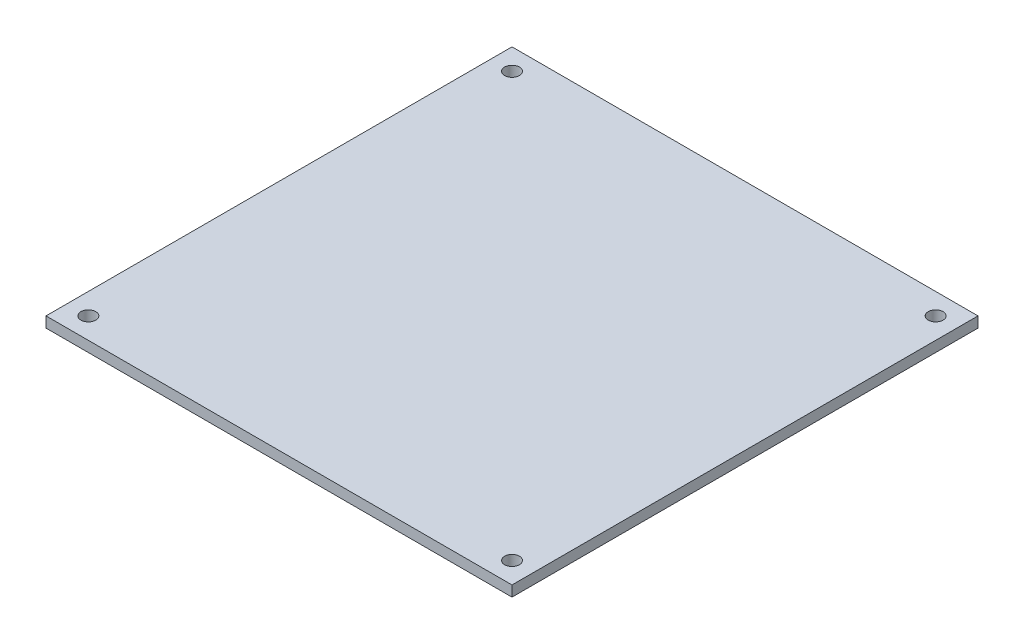
ISO-10303-21;
HEADER;
FILE_DESCRIPTION(('STEP AP214'),'2;1');
FILE_NAME('part.step','',(''),(''),'','','');
FILE_SCHEMA(('AUTOMOTIVE_DESIGN { 1 0 10303 214 1 1 1 1 }'));
ENDSEC;
DATA;
#1=APPLICATION_CONTEXT('core data for automotive mechanical design processes');
#2=APPLICATION_PROTOCOL_DEFINITION('international standard','automotive_design',2000,#1);
#3=PRODUCT_CONTEXT('',#1,'mechanical');
#4=PRODUCT('Part','Part','',(#3));
#5=PRODUCT_RELATED_PRODUCT_CATEGORY('part','',(#4));
#6=PRODUCT_DEFINITION_FORMATION('','',#4);
#7=PRODUCT_DEFINITION_CONTEXT('part definition',#1,'design');
#8=PRODUCT_DEFINITION('design','',#6,#7);
#9=PRODUCT_DEFINITION_SHAPE('','',#8);
#10=(LENGTH_UNIT() NAMED_UNIT(*) SI_UNIT(.MILLI.,.METRE.));
#11=(NAMED_UNIT(*) PLANE_ANGLE_UNIT() SI_UNIT($,.RADIAN.));
#12=(NAMED_UNIT(*) SI_UNIT($,.STERADIAN.) SOLID_ANGLE_UNIT());
#13=UNCERTAINTY_MEASURE_WITH_UNIT(LENGTH_MEASURE(1.E-05),#10,'distance_accuracy_value','');
#14=(GEOMETRIC_REPRESENTATION_CONTEXT(3) GLOBAL_UNCERTAINTY_ASSIGNED_CONTEXT((#13)) GLOBAL_UNIT_ASSIGNED_CONTEXT((#10,
#11,#12)) REPRESENTATION_CONTEXT('',''));
#15=CARTESIAN_POINT('',(0.,0.,0.));
#16=DIRECTION('',(0.,0.,1.));
#17=DIRECTION('',(1.,0.,0.));
#18=AXIS2_PLACEMENT_3D('',#15,#16,#17);
#19=CARTESIAN_POINT('',(110.,2.5,110.));
#20=DIRECTION('',(-1.,0.,0.));
#21=DIRECTION('',(0.,0.,1.));
#22=AXIS2_PLACEMENT_3D('',#19,#20,#21);
#23=PLANE('',#22);
#24=DIRECTION('',(0.,0.,-1.));
#25=VECTOR('',#24,1.);
#26=CARTESIAN_POINT('',(110.,-2.5,110.));
#27=LINE('',#26,#25);
#28=CARTESIAN_POINT('',(110.,-2.5,110.));
#29=VERTEX_POINT('',#28);
#30=CARTESIAN_POINT('',(110.,-2.5,-110.));
#31=VERTEX_POINT('',#30);
#32=EDGE_CURVE('E97',#29,#31,#27,.T.);
#33=ORIENTED_EDGE('',*,*,#32,.T.);
#34=DIRECTION('',(0.,-1.,0.));
#35=VECTOR('',#34,1.);
#36=CARTESIAN_POINT('',(110.,2.5,-110.));
#37=LINE('',#36,#35);
#38=CARTESIAN_POINT('',(110.,2.5,-110.));
#39=VERTEX_POINT('',#38);
#40=EDGE_CURVE('E11',#39,#31,#37,.T.);
#41=ORIENTED_EDGE('',*,*,#40,.F.);
#42=DIRECTION('',(0.,0.,-1.));
#43=VECTOR('',#42,1.);
#44=CARTESIAN_POINT('',(110.,2.5,110.));
#45=LINE('',#44,#43);
#46=CARTESIAN_POINT('',(110.,2.5,110.));
#47=VERTEX_POINT('',#46);
#48=EDGE_CURVE('E85',#47,#39,#45,.T.);
#49=ORIENTED_EDGE('',*,*,#48,.F.);
#50=DIRECTION('',(0.,-1.,0.));
#51=VECTOR('',#50,1.);
#52=CARTESIAN_POINT('',(110.,2.5,110.));
#53=LINE('',#52,#51);
#54=EDGE_CURVE('E93',#47,#29,#53,.T.);
#55=ORIENTED_EDGE('',*,*,#54,.T.);
#56=EDGE_LOOP('',(#33,#41,#49,#55));
#57=FACE_BOUND('',#56,.T.);
#58=ADVANCED_FACE('F34',(#57),#23,.F.);
#59=CARTESIAN_POINT('',(-110.,2.5,-110.));
#60=DIRECTION('',(0.,0.,1.));
#61=DIRECTION('',(1.,0.,0.));
#62=AXIS2_PLACEMENT_3D('',#59,#60,#61);
#63=PLANE('',#62);
#64=DIRECTION('',(-1.,0.,0.));
#65=VECTOR('',#64,1.);
#66=CARTESIAN_POINT('',(-110.,-2.5,-110.));
#67=LINE('',#66,#65);
#68=CARTESIAN_POINT('',(-110.,-2.5,-110.));
#69=VERTEX_POINT('',#68);
#70=EDGE_CURVE('E89',#31,#69,#67,.T.);
#71=ORIENTED_EDGE('',*,*,#70,.T.);
#72=DIRECTION('',(0.,-1.,0.));
#73=VECTOR('',#72,1.);
#74=CARTESIAN_POINT('',(-110.,2.5,-110.));
#75=LINE('',#74,#73);
#76=CARTESIAN_POINT('',(-110.,2.5,-110.));
#77=VERTEX_POINT('',#76);
#78=EDGE_CURVE('E42',#77,#69,#75,.T.);
#79=ORIENTED_EDGE('',*,*,#78,.F.);
#80=DIRECTION('',(-1.,0.,0.));
#81=VECTOR('',#80,1.);
#82=CARTESIAN_POINT('',(-110.,2.5,-110.));
#83=LINE('',#82,#81);
#84=EDGE_CURVE('E80',#39,#77,#83,.T.);
#85=ORIENTED_EDGE('',*,*,#84,.F.);
#86=ORIENTED_EDGE('',*,*,#40,.T.);
#87=EDGE_LOOP('',(#71,#79,#85,#86));
#88=FACE_BOUND('',#87,.T.);
#89=ADVANCED_FACE('F88',(#88),#63,.F.);
#90=CARTESIAN_POINT('',(-110.,2.5,110.));
#91=DIRECTION('',(1.,0.,0.));
#92=DIRECTION('',(0.,0.,-1.));
#93=AXIS2_PLACEMENT_3D('',#90,#91,#92);
#94=PLANE('',#93);
#95=DIRECTION('',(0.,0.,1.));
#96=VECTOR('',#95,1.);
#97=CARTESIAN_POINT('',(-110.,-2.5,110.));
#98=LINE('',#97,#96);
#99=CARTESIAN_POINT('',(-110.,-2.5,110.));
#100=VERTEX_POINT('',#99);
#101=EDGE_CURVE('E67',#69,#100,#98,.T.);
#102=ORIENTED_EDGE('',*,*,#101,.T.);
#103=DIRECTION('',(0.,-1.,0.));
#104=VECTOR('',#103,1.);
#105=CARTESIAN_POINT('',(-110.,2.5,110.));
#106=LINE('',#105,#104);
#107=CARTESIAN_POINT('',(-110.,2.5,110.));
#108=VERTEX_POINT('',#107);
#109=EDGE_CURVE('E90',#108,#100,#106,.T.);
#110=ORIENTED_EDGE('',*,*,#109,.F.);
#111=DIRECTION('',(0.,0.,1.));
#112=VECTOR('',#111,1.);
#113=CARTESIAN_POINT('',(-110.,2.5,110.));
#114=LINE('',#113,#112);
#115=EDGE_CURVE('E83',#77,#108,#114,.T.);
#116=ORIENTED_EDGE('',*,*,#115,.F.);
#117=ORIENTED_EDGE('',*,*,#78,.T.);
#118=EDGE_LOOP('',(#102,#110,#116,#117));
#119=FACE_BOUND('',#118,.T.);
#120=ADVANCED_FACE('F91',(#119),#94,.F.);
#121=CARTESIAN_POINT('',(-110.,2.5,110.));
#122=DIRECTION('',(0.,0.,-1.));
#123=DIRECTION('',(-1.,0.,0.));
#124=AXIS2_PLACEMENT_3D('',#121,#122,#123);
#125=PLANE('',#124);
#126=DIRECTION('',(1.,0.,0.));
#127=VECTOR('',#126,1.);
#128=CARTESIAN_POINT('',(-110.,-2.5,110.));
#129=LINE('',#128,#127);
#130=EDGE_CURVE('E73',#100,#29,#129,.T.);
#131=ORIENTED_EDGE('',*,*,#130,.T.);
#132=ORIENTED_EDGE('',*,*,#54,.F.);
#133=DIRECTION('',(1.,0.,0.));
#134=VECTOR('',#133,1.);
#135=CARTESIAN_POINT('',(-110.,2.5,110.));
#136=LINE('',#135,#134);
#137=EDGE_CURVE('E50',#108,#47,#136,.T.);
#138=ORIENTED_EDGE('',*,*,#137,.F.);
#139=ORIENTED_EDGE('',*,*,#109,.T.);
#140=EDGE_LOOP('',(#131,#132,#138,#139));
#141=FACE_BOUND('',#140,.T.);
#142=ADVANCED_FACE('F105',(#141),#125,.F.);
#143=CARTESIAN_POINT('',(0.,2.5,0.));
#144=DIRECTION('',(0.,-1.,0.));
#145=DIRECTION('',(0.,0.,-1.));
#146=AXIS2_PLACEMENT_3D('',#143,#144,#145);
#147=PLANE('',#146);
#148=CARTESIAN_POINT('',(-100.,2.5,100.));
#149=DIRECTION('',(0.,-1.,0.));
#150=DIRECTION('',(0.,0.,-1.));
#151=AXIS2_PLACEMENT_3D('',#148,#149,#150);
#152=CIRCLE('',#151,3.50000000000001);
#153=CARTESIAN_POINT('',(-100.,2.5,96.5));
#154=VERTEX_POINT('',#153);
#155=EDGE_CURVE('E129',#154,#154,#152,.T.);
#156=ORIENTED_EDGE('',*,*,#155,.T.);
#157=EDGE_LOOP('',(#156));
#158=FACE_BOUND('',#157,.T.);
#159=CARTESIAN_POINT('',(100.,2.5,100.));
#160=DIRECTION('',(0.,1.,0.));
#161=DIRECTION('',(0.,0.,-1.));
#162=AXIS2_PLACEMENT_3D('',#159,#160,#161);
#163=CIRCLE('',#162,3.50000000000001);
#164=CARTESIAN_POINT('',(100.,2.5,96.5));
#165=VERTEX_POINT('',#164);
#166=EDGE_CURVE('E123',#165,#165,#163,.T.);
#167=ORIENTED_EDGE('',*,*,#166,.F.);
#168=EDGE_LOOP('',(#167));
#169=FACE_BOUND('',#168,.T.);
#170=CARTESIAN_POINT('',(100.,2.5,-100.));
#171=DIRECTION('',(0.,-1.,0.));
#172=DIRECTION('',(0.,0.,1.));
#173=AXIS2_PLACEMENT_3D('',#170,#171,#172);
#174=CIRCLE('',#173,3.50000000000001);
#175=CARTESIAN_POINT('',(100.,2.5,-96.5));
#176=VERTEX_POINT('',#175);
#177=EDGE_CURVE('E117',#176,#176,#174,.T.);
#178=ORIENTED_EDGE('',*,*,#177,.T.);
#179=EDGE_LOOP('',(#178));
#180=FACE_BOUND('',#179,.T.);
#181=CARTESIAN_POINT('',(-100.,2.5,-100.));
#182=DIRECTION('',(0.,1.,0.));
#183=DIRECTION('',(0.,0.,1.));
#184=AXIS2_PLACEMENT_3D('',#181,#182,#183);
#185=CIRCLE('',#184,3.50000000000001);
#186=CARTESIAN_POINT('',(-100.,2.5,-96.5));
#187=VERTEX_POINT('',#186);
#188=EDGE_CURVE('E111',#187,#187,#185,.T.);
#189=ORIENTED_EDGE('',*,*,#188,.F.);
#190=EDGE_LOOP('',(#189));
#191=FACE_BOUND('',#190,.T.);
#192=ORIENTED_EDGE('',*,*,#48,.T.);
#193=ORIENTED_EDGE('',*,*,#84,.T.);
#194=ORIENTED_EDGE('',*,*,#115,.T.);
#195=ORIENTED_EDGE('',*,*,#137,.T.);
#196=EDGE_LOOP('',(#192,#193,#194,#195));
#197=FACE_BOUND('',#196,.T.);
#198=ADVANCED_FACE('F81',(#158,#169,#180,#191,#197),#147,.F.);
#199=CARTESIAN_POINT('',(0.,-2.5,0.));
#200=DIRECTION('',(0.,-1.,0.));
#201=DIRECTION('',(0.,0.,-1.));
#202=AXIS2_PLACEMENT_3D('',#199,#200,#201);
#203=PLANE('',#202);
#204=CARTESIAN_POINT('',(-100.,-2.5,100.));
#205=DIRECTION('',(0.,-1.,0.));
#206=DIRECTION('',(0.,0.,-1.));
#207=AXIS2_PLACEMENT_3D('',#204,#205,#206);
#208=CIRCLE('',#207,3.50000000000001);
#209=CARTESIAN_POINT('',(-100.,-2.5,96.5));
#210=VERTEX_POINT('',#209);
#211=EDGE_CURVE('E126',#210,#210,#208,.T.);
#212=ORIENTED_EDGE('',*,*,#211,.F.);
#213=EDGE_LOOP('',(#212));
#214=FACE_BOUND('',#213,.T.);
#215=CARTESIAN_POINT('',(100.,-2.5,100.));
#216=DIRECTION('',(0.,1.,0.));
#217=DIRECTION('',(0.,0.,-1.));
#218=AXIS2_PLACEMENT_3D('',#215,#216,#217);
#219=CIRCLE('',#218,3.50000000000001);
#220=CARTESIAN_POINT('',(100.,-2.5,96.5));
#221=VERTEX_POINT('',#220);
#222=EDGE_CURVE('E120',#221,#221,#219,.T.);
#223=ORIENTED_EDGE('',*,*,#222,.T.);
#224=EDGE_LOOP('',(#223));
#225=FACE_BOUND('',#224,.T.);
#226=CARTESIAN_POINT('',(100.,-2.5,-100.));
#227=DIRECTION('',(0.,-1.,0.));
#228=DIRECTION('',(0.,0.,1.));
#229=AXIS2_PLACEMENT_3D('',#226,#227,#228);
#230=CIRCLE('',#229,3.50000000000001);
#231=CARTESIAN_POINT('',(100.,-2.5,-96.5));
#232=VERTEX_POINT('',#231);
#233=EDGE_CURVE('E114',#232,#232,#230,.T.);
#234=ORIENTED_EDGE('',*,*,#233,.F.);
#235=EDGE_LOOP('',(#234));
#236=FACE_BOUND('',#235,.T.);
#237=CARTESIAN_POINT('',(-100.,-2.5,-100.));
#238=DIRECTION('',(0.,1.,0.));
#239=DIRECTION('',(0.,0.,1.));
#240=AXIS2_PLACEMENT_3D('',#237,#238,#239);
#241=CIRCLE('',#240,3.50000000000001);
#242=CARTESIAN_POINT('',(-100.,-2.5,-96.5));
#243=VERTEX_POINT('',#242);
#244=EDGE_CURVE('E100',#243,#243,#241,.T.);
#245=ORIENTED_EDGE('',*,*,#244,.T.);
#246=EDGE_LOOP('',(#245));
#247=FACE_BOUND('',#246,.T.);
#248=ORIENTED_EDGE('',*,*,#32,.F.);
#249=ORIENTED_EDGE('',*,*,#130,.F.);
#250=ORIENTED_EDGE('',*,*,#101,.F.);
#251=ORIENTED_EDGE('',*,*,#70,.F.);
#252=EDGE_LOOP('',(#248,#249,#250,#251));
#253=FACE_BOUND('',#252,.T.);
#254=ADVANCED_FACE('F108',(#214,#225,#236,#247,#253),#203,.T.);
#255=CARTESIAN_POINT('',(-100.,-2.5,-100.));
#256=DIRECTION('',(0.,1.,0.));
#257=DIRECTION('',(0.,0.,1.));
#258=AXIS2_PLACEMENT_3D('',#255,#256,#257);
#259=CYLINDRICAL_SURFACE('',#258,3.50000000000001);
#260=ORIENTED_EDGE('',*,*,#244,.F.);
#261=EDGE_LOOP('',(#260));
#262=FACE_BOUND('',#261,.T.);
#263=ORIENTED_EDGE('',*,*,#188,.T.);
#264=EDGE_LOOP('',(#263));
#265=FACE_BOUND('',#264,.T.);
#266=ADVANCED_FACE('F140',(#262,#265),#259,.F.);
#267=CARTESIAN_POINT('',(100.,-2.5,-100.));
#268=DIRECTION('',(0.,1.,0.));
#269=DIRECTION('',(0.,0.,1.));
#270=AXIS2_PLACEMENT_3D('',#267,#268,#269);
#271=CYLINDRICAL_SURFACE('',#270,3.50000000000001);
#272=ORIENTED_EDGE('',*,*,#233,.T.);
#273=EDGE_LOOP('',(#272));
#274=FACE_BOUND('',#273,.T.);
#275=ORIENTED_EDGE('',*,*,#177,.F.);
#276=EDGE_LOOP('',(#275));
#277=FACE_BOUND('',#276,.T.);
#278=ADVANCED_FACE('F150',(#274,#277),#271,.F.);
#279=CARTESIAN_POINT('',(100.,-2.5,100.));
#280=DIRECTION('',(0.,1.,0.));
#281=DIRECTION('',(0.,0.,1.));
#282=AXIS2_PLACEMENT_3D('',#279,#280,#281);
#283=CYLINDRICAL_SURFACE('',#282,3.50000000000001);
#284=ORIENTED_EDGE('',*,*,#222,.F.);
#285=EDGE_LOOP('',(#284));
#286=FACE_BOUND('',#285,.T.);
#287=ORIENTED_EDGE('',*,*,#166,.T.);
#288=EDGE_LOOP('',(#287));
#289=FACE_BOUND('',#288,.T.);
#290=ADVANCED_FACE('F192',(#286,#289),#283,.F.);
#291=CARTESIAN_POINT('',(-100.,-2.5,100.));
#292=DIRECTION('',(0.,1.,0.));
#293=DIRECTION('',(0.,0.,1.));
#294=AXIS2_PLACEMENT_3D('',#291,#292,#293);
#295=CYLINDRICAL_SURFACE('',#294,3.50000000000001);
#296=ORIENTED_EDGE('',*,*,#211,.T.);
#297=EDGE_LOOP('',(#296));
#298=FACE_BOUND('',#297,.T.);
#299=ORIENTED_EDGE('',*,*,#155,.F.);
#300=EDGE_LOOP('',(#299));
#301=FACE_BOUND('',#300,.T.);
#302=ADVANCED_FACE('F135',(#298,#301),#295,.F.);
#303=CLOSED_SHELL('',(#58,#89,#120,#142,#198,#254,#266,#278,#290,#302));
#304=MANIFOLD_SOLID_BREP('B2',#303);
#305=ADVANCED_BREP_SHAPE_REPRESENTATION('',(#18,#304),#14);
#306=SHAPE_DEFINITION_REPRESENTATION(#9,#305);
ENDSEC;
END-ISO-10303-21;
